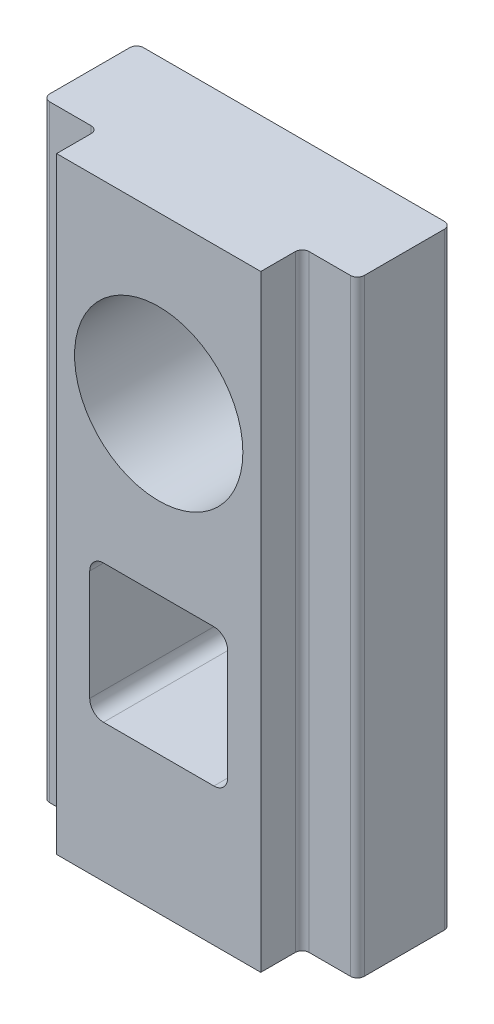
ISO-10303-21;
HEADER;
FILE_DESCRIPTION(('STEP AP214'),'2;1');
FILE_NAME('part.step','',(''),(''),'','','');
FILE_SCHEMA(('AUTOMOTIVE_DESIGN { 1 0 10303 214 1 1 1 1 }'));
ENDSEC;
DATA;
#1=APPLICATION_CONTEXT('core data for automotive mechanical design processes');
#2=APPLICATION_PROTOCOL_DEFINITION('international standard','automotive_design',2000,#1);
#3=PRODUCT_CONTEXT('',#1,'mechanical');
#4=PRODUCT('Part','Part','',(#3));
#5=PRODUCT_RELATED_PRODUCT_CATEGORY('part','',(#4));
#6=PRODUCT_DEFINITION_FORMATION('','',#4);
#7=PRODUCT_DEFINITION_CONTEXT('part definition',#1,'design');
#8=PRODUCT_DEFINITION('design','',#6,#7);
#9=PRODUCT_DEFINITION_SHAPE('','',#8);
#10=(LENGTH_UNIT() NAMED_UNIT(*) SI_UNIT(.MILLI.,.METRE.));
#11=(NAMED_UNIT(*) PLANE_ANGLE_UNIT() SI_UNIT($,.RADIAN.));
#12=(NAMED_UNIT(*) SI_UNIT($,.STERADIAN.) SOLID_ANGLE_UNIT());
#13=UNCERTAINTY_MEASURE_WITH_UNIT(LENGTH_MEASURE(1.E-05),#10,'distance_accuracy_value','');
#14=(GEOMETRIC_REPRESENTATION_CONTEXT(3) GLOBAL_UNCERTAINTY_ASSIGNED_CONTEXT((#13)) GLOBAL_UNIT_ASSIGNED_CONTEXT((#10,
#11,#12)) REPRESENTATION_CONTEXT('',''));
#15=CARTESIAN_POINT('',(0.,0.,0.));
#16=DIRECTION('',(0.,0.,1.));
#17=DIRECTION('',(1.,0.,0.));
#18=AXIS2_PLACEMENT_3D('',#15,#16,#17);
#19=CARTESIAN_POINT('',(5.7,-22.,-0.3));
#20=DIRECTION('',(0.,0.,1.));
#21=DIRECTION('',(1.,0.,0.));
#22=AXIS2_PLACEMENT_3D('',#19,#20,#21);
#23=PLANE('',#22);
#24=DIRECTION('',(1.,0.,0.));
#25=VECTOR('',#24,1.);
#26=CARTESIAN_POINT('',(5.7,-22.,-0.3));
#27=LINE('',#26,#25);
#28=CARTESIAN_POINT('',(3.95,-22.,-0.3));
#29=VERTEX_POINT('',#28);
#30=CARTESIAN_POINT('',(5.45,-22.,-0.3));
#31=VERTEX_POINT('',#30);
#32=EDGE_CURVE('E235',#29,#31,#27,.T.);
#33=ORIENTED_EDGE('',*,*,#32,.T.);
#34=DIRECTION('',(0.,1.,0.));
#35=VECTOR('',#34,1.);
#36=CARTESIAN_POINT('',(5.45,-22.,-0.3));
#37=LINE('',#36,#35);
#38=CARTESIAN_POINT('',(5.45,0.,-0.3));
#39=VERTEX_POINT('',#38);
#40=EDGE_CURVE('E265',#31,#39,#37,.T.);
#41=ORIENTED_EDGE('',*,*,#40,.T.);
#42=DIRECTION('',(1.,0.,0.));
#43=VECTOR('',#42,1.);
#44=CARTESIAN_POINT('',(5.7,0.,-0.3));
#45=LINE('',#44,#43);
#46=CARTESIAN_POINT('',(3.95,0.,-0.3));
#47=VERTEX_POINT('',#46);
#48=EDGE_CURVE('E213',#47,#39,#45,.T.);
#49=ORIENTED_EDGE('',*,*,#48,.F.);
#50=DIRECTION('',(0.,1.,0.));
#51=VECTOR('',#50,1.);
#52=CARTESIAN_POINT('',(3.95,-22.,-0.3));
#53=LINE('',#52,#51);
#54=EDGE_CURVE('E263',#47,#29,#53,.F.);
#55=ORIENTED_EDGE('',*,*,#54,.T.);
#56=EDGE_LOOP('',(#33,#41,#49,#55));
#57=FACE_BOUND('',#56,.T.);
#58=ADVANCED_FACE('F34',(#57),#23,.T.);
#59=CARTESIAN_POINT('',(3.7,-22.,-0.3));
#60=DIRECTION('',(1.,0.,0.));
#61=DIRECTION('',(0.,0.,-1.));
#62=AXIS2_PLACEMENT_3D('',#59,#60,#61);
#63=PLANE('',#62);
#64=DIRECTION('',(0.,0.,-1.));
#65=VECTOR('',#64,1.);
#66=CARTESIAN_POINT('',(3.7,-22.,-0.3));
#67=LINE('',#66,#65);
#68=CARTESIAN_POINT('',(3.7,-22.,1.2));
#69=VERTEX_POINT('',#68);
#70=CARTESIAN_POINT('',(3.7,-22.,-0.0499999999999998));
#71=VERTEX_POINT('',#70);
#72=EDGE_CURVE('E204',#69,#71,#67,.T.);
#73=ORIENTED_EDGE('',*,*,#72,.T.);
#74=DIRECTION('',(0.,1.,0.));
#75=VECTOR('',#74,1.);
#76=CARTESIAN_POINT('',(3.7,0.,-0.0499999999999998));
#77=LINE('',#76,#75);
#78=CARTESIAN_POINT('',(3.7,0.,-0.0499999999999998));
#79=VERTEX_POINT('',#78);
#80=EDGE_CURVE('E268',#71,#79,#77,.T.);
#81=ORIENTED_EDGE('',*,*,#80,.T.);
#82=DIRECTION('',(0.,0.,-1.));
#83=VECTOR('',#82,1.);
#84=CARTESIAN_POINT('',(3.7,0.,-0.3));
#85=LINE('',#84,#83);
#86=CARTESIAN_POINT('',(3.7,0.,1.2));
#87=VERTEX_POINT('',#86);
#88=EDGE_CURVE('E232',#87,#79,#85,.T.);
#89=ORIENTED_EDGE('',*,*,#88,.F.);
#90=DIRECTION('',(0.,1.,0.));
#91=VECTOR('',#90,1.);
#92=CARTESIAN_POINT('',(3.7,-22.,1.2));
#93=LINE('',#92,#91);
#94=EDGE_CURVE('E203',#69,#87,#93,.T.);
#95=ORIENTED_EDGE('',*,*,#94,.F.);
#96=EDGE_LOOP('',(#73,#81,#89,#95));
#97=FACE_BOUND('',#96,.T.);
#98=ADVANCED_FACE('F416',(#97),#63,.T.);
#99=CARTESIAN_POINT('',(-3.7,-22.,1.2));
#100=DIRECTION('',(0.,0.,1.));
#101=DIRECTION('',(1.,0.,0.));
#102=AXIS2_PLACEMENT_3D('',#99,#100,#101);
#103=PLANE('',#102);
#104=CARTESIAN_POINT('',(0.,-6.,1.2));
#105=DIRECTION('',(0.,0.,1.));
#106=DIRECTION('',(1.,0.,0.));
#107=AXIS2_PLACEMENT_3D('',#104,#105,#106);
#108=CIRCLE('',#107,3.05);
#109=CARTESIAN_POINT('',(3.05,-6.,1.2));
#110=VERTEX_POINT('',#109);
#111=EDGE_CURVE('E348',#110,#110,#108,.T.);
#112=ORIENTED_EDGE('',*,*,#111,.F.);
#113=EDGE_LOOP('',(#112));
#114=FACE_BOUND('',#113,.T.);
#115=DIRECTION('',(0.,1.,0.));
#116=VECTOR('',#115,1.);
#117=CARTESIAN_POINT('',(2.5,-12.,1.2));
#118=LINE('',#117,#116);
#119=CARTESIAN_POINT('',(2.5,-16.5,1.2));
#120=VERTEX_POINT('',#119);
#121=CARTESIAN_POINT('',(2.5,-12.5,1.2));
#122=VERTEX_POINT('',#121);
#123=EDGE_CURVE('E324',#120,#122,#118,.T.);
#124=ORIENTED_EDGE('',*,*,#123,.F.);
#125=CARTESIAN_POINT('',(2.,-16.5,1.2));
#126=DIRECTION('',(0.,0.,1.));
#127=DIRECTION('',(1.,0.,0.));
#128=AXIS2_PLACEMENT_3D('',#125,#126,#127);
#129=CIRCLE('',#128,0.5);
#130=CARTESIAN_POINT('',(2.,-17.,1.2));
#131=VERTEX_POINT('',#130);
#132=EDGE_CURVE('E309',#120,#131,#129,.F.);
#133=ORIENTED_EDGE('',*,*,#132,.T.);
#134=DIRECTION('',(1.,0.,0.));
#135=VECTOR('',#134,1.);
#136=CARTESIAN_POINT('',(-2.5,-17.,1.2));
#137=LINE('',#136,#135);
#138=CARTESIAN_POINT('',(-2.,-17.,1.2));
#139=VERTEX_POINT('',#138);
#140=EDGE_CURVE('E343',#139,#131,#137,.T.);
#141=ORIENTED_EDGE('',*,*,#140,.F.);
#142=CARTESIAN_POINT('',(-2.,-16.5,1.2));
#143=DIRECTION('',(0.,0.,1.));
#144=DIRECTION('',(1.,0.,0.));
#145=AXIS2_PLACEMENT_3D('',#142,#143,#144);
#146=CIRCLE('',#145,0.5);
#147=CARTESIAN_POINT('',(-2.5,-16.5,1.2));
#148=VERTEX_POINT('',#147);
#149=EDGE_CURVE('E313',#139,#148,#146,.F.);
#150=ORIENTED_EDGE('',*,*,#149,.T.);
#151=DIRECTION('',(0.,-1.,0.));
#152=VECTOR('',#151,1.);
#153=CARTESIAN_POINT('',(-2.5,-12.,1.2));
#154=LINE('',#153,#152);
#155=CARTESIAN_POINT('',(-2.5,-12.5,1.2));
#156=VERTEX_POINT('',#155);
#157=EDGE_CURVE('E351',#156,#148,#154,.T.);
#158=ORIENTED_EDGE('',*,*,#157,.F.);
#159=CARTESIAN_POINT('',(-2.,-12.5,1.2));
#160=DIRECTION('',(0.,0.,1.));
#161=DIRECTION('',(1.,0.,0.));
#162=AXIS2_PLACEMENT_3D('',#159,#160,#161);
#163=CIRCLE('',#162,0.5);
#164=CARTESIAN_POINT('',(-2.,-12.,1.2));
#165=VERTEX_POINT('',#164);
#166=EDGE_CURVE('E317',#156,#165,#163,.F.);
#167=ORIENTED_EDGE('',*,*,#166,.T.);
#168=DIRECTION('',(-1.,0.,0.));
#169=VECTOR('',#168,1.);
#170=CARTESIAN_POINT('',(-2.5,-12.,1.2));
#171=LINE('',#170,#169);
#172=CARTESIAN_POINT('',(2.,-12.,1.2));
#173=VERTEX_POINT('',#172);
#174=EDGE_CURVE('E325',#173,#165,#171,.T.);
#175=ORIENTED_EDGE('',*,*,#174,.F.);
#176=CARTESIAN_POINT('',(2.,-12.5,1.2));
#177=DIRECTION('',(0.,0.,1.));
#178=DIRECTION('',(1.,0.,0.));
#179=AXIS2_PLACEMENT_3D('',#176,#177,#178);
#180=CIRCLE('',#179,0.5);
#181=EDGE_CURVE('E42',#173,#122,#180,.F.);
#182=ORIENTED_EDGE('',*,*,#181,.T.);
#183=EDGE_LOOP('',(#124,#133,#141,#150,#158,#167,#175,#182));
#184=FACE_BOUND('',#183,.T.);
#185=DIRECTION('',(1.,0.,0.));
#186=VECTOR('',#185,1.);
#187=CARTESIAN_POINT('',(-3.7,0.,1.2));
#188=LINE('',#187,#186);
#189=CARTESIAN_POINT('',(-3.7,0.,1.2));
#190=VERTEX_POINT('',#189);
#191=EDGE_CURVE('E202',#190,#87,#188,.T.);
#192=ORIENTED_EDGE('',*,*,#191,.F.);
#193=DIRECTION('',(0.,1.,0.));
#194=VECTOR('',#193,1.);
#195=CARTESIAN_POINT('',(-3.7,-22.,1.2));
#196=LINE('',#195,#194);
#197=CARTESIAN_POINT('',(-3.7,-22.,1.2));
#198=VERTEX_POINT('',#197);
#199=EDGE_CURVE('E187',#198,#190,#196,.T.);
#200=ORIENTED_EDGE('',*,*,#199,.F.);
#201=DIRECTION('',(1.,0.,0.));
#202=VECTOR('',#201,1.);
#203=CARTESIAN_POINT('',(-3.7,-22.,1.2));
#204=LINE('',#203,#202);
#205=EDGE_CURVE('E194',#198,#69,#204,.T.);
#206=ORIENTED_EDGE('',*,*,#205,.T.);
#207=ORIENTED_EDGE('',*,*,#94,.T.);
#208=EDGE_LOOP('',(#192,#200,#206,#207));
#209=FACE_BOUND('',#208,.T.);
#210=ADVANCED_FACE('F199',(#114,#184,#209),#103,.T.);
#211=CARTESIAN_POINT('',(-3.7,-22.,-0.3));
#212=DIRECTION('',(-1.,0.,0.));
#213=DIRECTION('',(0.,0.,1.));
#214=AXIS2_PLACEMENT_3D('',#211,#212,#213);
#215=PLANE('',#214);
#216=DIRECTION('',(0.,0.,1.));
#217=VECTOR('',#216,1.);
#218=CARTESIAN_POINT('',(-3.7,0.,-0.3));
#219=LINE('',#218,#217);
#220=CARTESIAN_POINT('',(-3.7,0.,-0.05));
#221=VERTEX_POINT('',#220);
#222=EDGE_CURVE('E229',#221,#190,#219,.T.);
#223=ORIENTED_EDGE('',*,*,#222,.F.);
#224=DIRECTION('',(0.,1.,0.));
#225=VECTOR('',#224,1.);
#226=CARTESIAN_POINT('',(-3.7,-22.,-0.05));
#227=LINE('',#226,#225);
#228=CARTESIAN_POINT('',(-3.7,-22.,-0.05));
#229=VERTEX_POINT('',#228);
#230=EDGE_CURVE('E190',#221,#229,#227,.F.);
#231=ORIENTED_EDGE('',*,*,#230,.T.);
#232=DIRECTION('',(0.,0.,1.));
#233=VECTOR('',#232,1.);
#234=CARTESIAN_POINT('',(-3.7,-22.,-0.3));
#235=LINE('',#234,#233);
#236=EDGE_CURVE('E183',#229,#198,#235,.T.);
#237=ORIENTED_EDGE('',*,*,#236,.T.);
#238=ORIENTED_EDGE('',*,*,#199,.T.);
#239=EDGE_LOOP('',(#223,#231,#237,#238));
#240=FACE_BOUND('',#239,.T.);
#241=ADVANCED_FACE('F186',(#240),#215,.T.);
#242=CARTESIAN_POINT('',(-5.7,-22.,-0.3));
#243=DIRECTION('',(0.,0.,1.));
#244=DIRECTION('',(1.,0.,0.));
#245=AXIS2_PLACEMENT_3D('',#242,#243,#244);
#246=PLANE('',#245);
#247=DIRECTION('',(1.,0.,0.));
#248=VECTOR('',#247,1.);
#249=CARTESIAN_POINT('',(-5.7,-22.,-0.3));
#250=LINE('',#249,#248);
#251=CARTESIAN_POINT('',(-5.45,-22.,-0.3));
#252=VERTEX_POINT('',#251);
#253=CARTESIAN_POINT('',(-3.95,-22.,-0.3));
#254=VERTEX_POINT('',#253);
#255=EDGE_CURVE('E195',#252,#254,#250,.T.);
#256=ORIENTED_EDGE('',*,*,#255,.T.);
#257=DIRECTION('',(0.,1.,0.));
#258=VECTOR('',#257,1.);
#259=CARTESIAN_POINT('',(-3.95,0.,-0.3));
#260=LINE('',#259,#258);
#261=CARTESIAN_POINT('',(-3.95,0.,-0.3));
#262=VERTEX_POINT('',#261);
#263=EDGE_CURVE('E273',#254,#262,#260,.T.);
#264=ORIENTED_EDGE('',*,*,#263,.T.);
#265=DIRECTION('',(1.,0.,0.));
#266=VECTOR('',#265,1.);
#267=CARTESIAN_POINT('',(-5.7,0.,-0.3));
#268=LINE('',#267,#266);
#269=CARTESIAN_POINT('',(-5.45,0.,-0.3));
#270=VERTEX_POINT('',#269);
#271=EDGE_CURVE('E226',#270,#262,#268,.T.);
#272=ORIENTED_EDGE('',*,*,#271,.F.);
#273=DIRECTION('',(0.,1.,0.));
#274=VECTOR('',#273,1.);
#275=CARTESIAN_POINT('',(-5.45,-22.,-0.3));
#276=LINE('',#275,#274);
#277=EDGE_CURVE('E271',#270,#252,#276,.F.);
#278=ORIENTED_EDGE('',*,*,#277,.T.);
#279=EDGE_LOOP('',(#256,#264,#272,#278));
#280=FACE_BOUND('',#279,.T.);
#281=ADVANCED_FACE('F370',(#280),#246,.T.);
#282=CARTESIAN_POINT('',(-5.7,-22.,-3.7));
#283=DIRECTION('',(-1.,0.,0.));
#284=DIRECTION('',(0.,0.,1.));
#285=AXIS2_PLACEMENT_3D('',#282,#283,#284);
#286=PLANE('',#285);
#287=DIRECTION('',(0.,0.,1.));
#288=VECTOR('',#287,1.);
#289=CARTESIAN_POINT('',(-5.7,-22.,-3.7));
#290=LINE('',#289,#288);
#291=CARTESIAN_POINT('',(-5.7,-22.,-3.45));
#292=VERTEX_POINT('',#291);
#293=CARTESIAN_POINT('',(-5.7,-22.,-0.55));
#294=VERTEX_POINT('',#293);
#295=EDGE_CURVE('E364',#292,#294,#290,.T.);
#296=ORIENTED_EDGE('',*,*,#295,.T.);
#297=DIRECTION('',(0.,1.,0.));
#298=VECTOR('',#297,1.);
#299=CARTESIAN_POINT('',(-5.7,-22.,-0.55));
#300=LINE('',#299,#298);
#301=CARTESIAN_POINT('',(-5.7,0.,-0.55));
#302=VERTEX_POINT('',#301);
#303=EDGE_CURVE('E279',#294,#302,#300,.T.);
#304=ORIENTED_EDGE('',*,*,#303,.T.);
#305=DIRECTION('',(0.,0.,1.));
#306=VECTOR('',#305,1.);
#307=CARTESIAN_POINT('',(-5.7,0.,-3.7));
#308=LINE('',#307,#306);
#309=CARTESIAN_POINT('',(-5.7,0.,-3.45));
#310=VERTEX_POINT('',#309);
#311=EDGE_CURVE('E223',#310,#302,#308,.T.);
#312=ORIENTED_EDGE('',*,*,#311,.F.);
#313=DIRECTION('',(0.,1.,0.));
#314=VECTOR('',#313,1.);
#315=CARTESIAN_POINT('',(-5.7,-22.,-3.45));
#316=LINE('',#315,#314);
#317=EDGE_CURVE('E277',#310,#292,#316,.F.);
#318=ORIENTED_EDGE('',*,*,#317,.T.);
#319=EDGE_LOOP('',(#296,#304,#312,#318));
#320=FACE_BOUND('',#319,.T.);
#321=ADVANCED_FACE('F384',(#320),#286,.T.);
#322=CARTESIAN_POINT('',(5.7,-22.,-3.7));
#323=DIRECTION('',(0.,0.,-1.));
#324=DIRECTION('',(-1.,0.,0.));
#325=AXIS2_PLACEMENT_3D('',#322,#323,#324);
#326=PLANE('',#325);
#327=CARTESIAN_POINT('',(0.,-6.,-3.7));
#328=DIRECTION('',(0.,0.,1.));
#329=DIRECTION('',(1.,0.,0.));
#330=AXIS2_PLACEMENT_3D('',#327,#328,#329);
#331=CIRCLE('',#330,3.05);
#332=CARTESIAN_POINT('',(3.05,-6.,-3.7));
#333=VERTEX_POINT('',#332);
#334=EDGE_CURVE('E217',#333,#333,#331,.T.);
#335=ORIENTED_EDGE('',*,*,#334,.T.);
#336=EDGE_LOOP('',(#335));
#337=FACE_BOUND('',#336,.T.);
#338=DIRECTION('',(1.,0.,0.));
#339=VECTOR('',#338,1.);
#340=CARTESIAN_POINT('',(-2.5,-17.,-3.7));
#341=LINE('',#340,#339);
#342=CARTESIAN_POINT('',(-2.,-17.,-3.7));
#343=VERTEX_POINT('',#342);
#344=CARTESIAN_POINT('',(2.,-17.,-3.7));
#345=VERTEX_POINT('',#344);
#346=EDGE_CURVE('E341',#343,#345,#341,.T.);
#347=ORIENTED_EDGE('',*,*,#346,.T.);
#348=CARTESIAN_POINT('',(2.,-16.5,-3.7));
#349=DIRECTION('',(0.,0.,-1.));
#350=DIRECTION('',(-1.,0.,0.));
#351=AXIS2_PLACEMENT_3D('',#348,#349,#350);
#352=CIRCLE('',#351,0.5);
#353=CARTESIAN_POINT('',(2.5,-16.5,-3.7));
#354=VERTEX_POINT('',#353);
#355=EDGE_CURVE('E311',#345,#354,#352,.F.);
#356=ORIENTED_EDGE('',*,*,#355,.T.);
#357=DIRECTION('',(0.,1.,0.));
#358=VECTOR('',#357,1.);
#359=CARTESIAN_POINT('',(2.5,-12.,-3.7));
#360=LINE('',#359,#358);
#361=CARTESIAN_POINT('',(2.5,-12.5,-3.7));
#362=VERTEX_POINT('',#361);
#363=EDGE_CURVE('E338',#354,#362,#360,.T.);
#364=ORIENTED_EDGE('',*,*,#363,.T.);
#365=CARTESIAN_POINT('',(2.,-12.5,-3.7));
#366=DIRECTION('',(0.,0.,-1.));
#367=DIRECTION('',(-1.,0.,0.));
#368=AXIS2_PLACEMENT_3D('',#365,#366,#367);
#369=CIRCLE('',#368,0.5);
#370=CARTESIAN_POINT('',(2.,-12.,-3.7));
#371=VERTEX_POINT('',#370);
#372=EDGE_CURVE('E11',#362,#371,#369,.F.);
#373=ORIENTED_EDGE('',*,*,#372,.T.);
#374=DIRECTION('',(-1.,0.,0.));
#375=VECTOR('',#374,1.);
#376=CARTESIAN_POINT('',(-2.5,-12.,-3.7));
#377=LINE('',#376,#375);
#378=CARTESIAN_POINT('',(-2.,-12.,-3.7));
#379=VERTEX_POINT('',#378);
#380=EDGE_CURVE('E335',#371,#379,#377,.T.);
#381=ORIENTED_EDGE('',*,*,#380,.T.);
#382=CARTESIAN_POINT('',(-2.,-12.5,-3.7));
#383=DIRECTION('',(0.,0.,-1.));
#384=DIRECTION('',(-1.,0.,0.));
#385=AXIS2_PLACEMENT_3D('',#382,#383,#384);
#386=CIRCLE('',#385,0.5);
#387=CARTESIAN_POINT('',(-2.5,-12.5,-3.7));
#388=VERTEX_POINT('',#387);
#389=EDGE_CURVE('E319',#379,#388,#386,.F.);
#390=ORIENTED_EDGE('',*,*,#389,.T.);
#391=DIRECTION('',(0.,-1.,0.));
#392=VECTOR('',#391,1.);
#393=CARTESIAN_POINT('',(-2.5,-12.,-3.7));
#394=LINE('',#393,#392);
#395=CARTESIAN_POINT('',(-2.5,-16.5,-3.7));
#396=VERTEX_POINT('',#395);
#397=EDGE_CURVE('E337',#388,#396,#394,.T.);
#398=ORIENTED_EDGE('',*,*,#397,.T.);
#399=CARTESIAN_POINT('',(-2.,-16.5,-3.7));
#400=DIRECTION('',(0.,0.,-1.));
#401=DIRECTION('',(-1.,0.,0.));
#402=AXIS2_PLACEMENT_3D('',#399,#400,#401);
#403=CIRCLE('',#402,0.5);
#404=EDGE_CURVE('E315',#396,#343,#403,.F.);
#405=ORIENTED_EDGE('',*,*,#404,.T.);
#406=EDGE_LOOP('',(#347,#356,#364,#373,#381,#390,#398,#405));
#407=FACE_BOUND('',#406,.T.);
#408=DIRECTION('',(-1.,0.,0.));
#409=VECTOR('',#408,1.);
#410=CARTESIAN_POINT('',(5.7,0.,-3.7));
#411=LINE('',#410,#409);
#412=CARTESIAN_POINT('',(5.45,0.,-3.7));
#413=VERTEX_POINT('',#412);
#414=CARTESIAN_POINT('',(-5.45,0.,-3.7));
#415=VERTEX_POINT('',#414);
#416=EDGE_CURVE('E220',#413,#415,#411,.T.);
#417=ORIENTED_EDGE('',*,*,#416,.F.);
#418=DIRECTION('',(0.,1.,0.));
#419=VECTOR('',#418,1.);
#420=CARTESIAN_POINT('',(5.45,-22.,-3.7));
#421=LINE('',#420,#419);
#422=CARTESIAN_POINT('',(5.45,-22.,-3.7));
#423=VERTEX_POINT('',#422);
#424=EDGE_CURVE('E253',#413,#423,#421,.F.);
#425=ORIENTED_EDGE('',*,*,#424,.T.);
#426=DIRECTION('',(-1.,0.,0.));
#427=VECTOR('',#426,1.);
#428=CARTESIAN_POINT('',(5.7,-22.,-3.7));
#429=LINE('',#428,#427);
#430=CARTESIAN_POINT('',(-5.45,-22.,-3.7));
#431=VERTEX_POINT('',#430);
#432=EDGE_CURVE('E361',#423,#431,#429,.T.);
#433=ORIENTED_EDGE('',*,*,#432,.T.);
#434=DIRECTION('',(0.,1.,0.));
#435=VECTOR('',#434,1.);
#436=CARTESIAN_POINT('',(-5.45,-22.,-3.7));
#437=LINE('',#436,#435);
#438=EDGE_CURVE('E250',#431,#415,#437,.T.);
#439=ORIENTED_EDGE('',*,*,#438,.T.);
#440=EDGE_LOOP('',(#417,#425,#433,#439));
#441=FACE_BOUND('',#440,.T.);
#442=ADVANCED_FACE('F393',(#337,#407,#441),#326,.T.);
#443=CARTESIAN_POINT('',(5.7,-22.,-3.7));
#444=DIRECTION('',(1.,0.,0.));
#445=DIRECTION('',(0.,0.,-1.));
#446=AXIS2_PLACEMENT_3D('',#443,#444,#445);
#447=PLANE('',#446);
#448=DIRECTION('',(0.,0.,-1.));
#449=VECTOR('',#448,1.);
#450=CARTESIAN_POINT('',(5.7,-22.,-3.7));
#451=LINE('',#450,#449);
#452=CARTESIAN_POINT('',(5.7,-22.,-0.55));
#453=VERTEX_POINT('',#452);
#454=CARTESIAN_POINT('',(5.7,-22.,-3.45));
#455=VERTEX_POINT('',#454);
#456=EDGE_CURVE('E358',#453,#455,#451,.T.);
#457=ORIENTED_EDGE('',*,*,#456,.T.);
#458=DIRECTION('',(0.,1.,0.));
#459=VECTOR('',#458,1.);
#460=CARTESIAN_POINT('',(5.7,-22.,-3.45));
#461=LINE('',#460,#459);
#462=CARTESIAN_POINT('',(5.7,0.,-3.45));
#463=VERTEX_POINT('',#462);
#464=EDGE_CURVE('E239',#455,#463,#461,.T.);
#465=ORIENTED_EDGE('',*,*,#464,.T.);
#466=DIRECTION('',(0.,0.,-1.));
#467=VECTOR('',#466,1.);
#468=CARTESIAN_POINT('',(5.7,0.,-3.7));
#469=LINE('',#468,#467);
#470=CARTESIAN_POINT('',(5.7,0.,-0.55));
#471=VERTEX_POINT('',#470);
#472=EDGE_CURVE('E216',#471,#463,#469,.T.);
#473=ORIENTED_EDGE('',*,*,#472,.F.);
#474=DIRECTION('',(0.,1.,0.));
#475=VECTOR('',#474,1.);
#476=CARTESIAN_POINT('',(5.7,-22.,-0.55));
#477=LINE('',#476,#475);
#478=EDGE_CURVE('E236',#471,#453,#477,.F.);
#479=ORIENTED_EDGE('',*,*,#478,.T.);
#480=EDGE_LOOP('',(#457,#465,#473,#479));
#481=FACE_BOUND('',#480,.T.);
#482=ADVANCED_FACE('F401',(#481),#447,.T.);
#483=CARTESIAN_POINT('',(0.,-22.,0.));
#484=DIRECTION('',(0.,1.,0.));
#485=DIRECTION('',(0.,0.,1.));
#486=AXIS2_PLACEMENT_3D('',#483,#484,#485);
#487=PLANE('',#486);
#488=ORIENTED_EDGE('',*,*,#432,.F.);
#489=CARTESIAN_POINT('',(5.45,-22.,-3.45));
#490=DIRECTION('',(0.,1.,0.));
#491=DIRECTION('',(0.,0.,1.));
#492=AXIS2_PLACEMENT_3D('',#489,#490,#491);
#493=CIRCLE('',#492,0.25);
#494=EDGE_CURVE('E261',#423,#455,#493,.F.);
#495=ORIENTED_EDGE('',*,*,#494,.T.);
#496=ORIENTED_EDGE('',*,*,#456,.F.);
#497=CARTESIAN_POINT('',(5.45,-22.,-0.55));
#498=DIRECTION('',(0.,1.,0.));
#499=DIRECTION('',(0.,0.,1.));
#500=AXIS2_PLACEMENT_3D('',#497,#498,#499);
#501=CIRCLE('',#500,0.25);
#502=EDGE_CURVE('E259',#453,#31,#501,.F.);
#503=ORIENTED_EDGE('',*,*,#502,.T.);
#504=ORIENTED_EDGE('',*,*,#32,.F.);
#505=CARTESIAN_POINT('',(3.95,-22.,-0.0499999999999998));
#506=DIRECTION('',(0.,1.,0.));
#507=DIRECTION('',(0.,0.,1.));
#508=AXIS2_PLACEMENT_3D('',#505,#506,#507);
#509=CIRCLE('',#508,0.25);
#510=EDGE_CURVE('E284',#29,#71,#509,.T.);
#511=ORIENTED_EDGE('',*,*,#510,.T.);
#512=ORIENTED_EDGE('',*,*,#72,.F.);
#513=ORIENTED_EDGE('',*,*,#205,.F.);
#514=ORIENTED_EDGE('',*,*,#236,.F.);
#515=CARTESIAN_POINT('',(-3.95,-22.,-0.05));
#516=DIRECTION('',(0.,1.,0.));
#517=DIRECTION('',(0.,0.,1.));
#518=AXIS2_PLACEMENT_3D('',#515,#516,#517);
#519=CIRCLE('',#518,0.25);
#520=EDGE_CURVE('E288',#229,#254,#519,.T.);
#521=ORIENTED_EDGE('',*,*,#520,.T.);
#522=ORIENTED_EDGE('',*,*,#255,.F.);
#523=CARTESIAN_POINT('',(-5.45,-22.,-0.55));
#524=DIRECTION('',(0.,1.,0.));
#525=DIRECTION('',(0.,0.,1.));
#526=AXIS2_PLACEMENT_3D('',#523,#524,#525);
#527=CIRCLE('',#526,0.25);
#528=EDGE_CURVE('E257',#252,#294,#527,.F.);
#529=ORIENTED_EDGE('',*,*,#528,.T.);
#530=ORIENTED_EDGE('',*,*,#295,.F.);
#531=CARTESIAN_POINT('',(-5.45,-22.,-3.45));
#532=DIRECTION('',(0.,1.,0.));
#533=DIRECTION('',(0.,0.,1.));
#534=AXIS2_PLACEMENT_3D('',#531,#532,#533);
#535=CIRCLE('',#534,0.25);
#536=EDGE_CURVE('E255',#292,#431,#535,.F.);
#537=ORIENTED_EDGE('',*,*,#536,.T.);
#538=EDGE_LOOP('',(#488,#495,#496,#503,#504,#511,#512,#513,#514,#521,#522,#529,#530,#537));
#539=FACE_BOUND('',#538,.T.);
#540=ADVANCED_FACE('F207',(#539),#487,.F.);
#541=CARTESIAN_POINT('',(0.,0.,0.));
#542=DIRECTION('',(0.,1.,0.));
#543=DIRECTION('',(0.,0.,1.));
#544=AXIS2_PLACEMENT_3D('',#541,#542,#543);
#545=PLANE('',#544);
#546=ORIENTED_EDGE('',*,*,#472,.T.);
#547=CARTESIAN_POINT('',(5.45,0.,-3.45));
#548=DIRECTION('',(0.,1.,0.));
#549=DIRECTION('',(0.,0.,1.));
#550=AXIS2_PLACEMENT_3D('',#547,#548,#549);
#551=CIRCLE('',#550,0.25);
#552=EDGE_CURVE('E248',#463,#413,#551,.T.);
#553=ORIENTED_EDGE('',*,*,#552,.T.);
#554=ORIENTED_EDGE('',*,*,#416,.T.);
#555=CARTESIAN_POINT('',(-5.45,0.,-3.45));
#556=DIRECTION('',(0.,1.,0.));
#557=DIRECTION('',(0.,0.,1.));
#558=AXIS2_PLACEMENT_3D('',#555,#556,#557);
#559=CIRCLE('',#558,0.25);
#560=EDGE_CURVE('E242',#415,#310,#559,.T.);
#561=ORIENTED_EDGE('',*,*,#560,.T.);
#562=ORIENTED_EDGE('',*,*,#311,.T.);
#563=CARTESIAN_POINT('',(-5.45,0.,-0.55));
#564=DIRECTION('',(0.,1.,0.));
#565=DIRECTION('',(0.,0.,1.));
#566=AXIS2_PLACEMENT_3D('',#563,#564,#565);
#567=CIRCLE('',#566,0.25);
#568=EDGE_CURVE('E244',#302,#270,#567,.T.);
#569=ORIENTED_EDGE('',*,*,#568,.T.);
#570=ORIENTED_EDGE('',*,*,#271,.T.);
#571=CARTESIAN_POINT('',(-3.95,0.,-0.05));
#572=DIRECTION('',(0.,1.,0.));
#573=DIRECTION('',(0.,0.,1.));
#574=AXIS2_PLACEMENT_3D('',#571,#572,#573);
#575=CIRCLE('',#574,0.25);
#576=EDGE_CURVE('E286',#262,#221,#575,.F.);
#577=ORIENTED_EDGE('',*,*,#576,.T.);
#578=ORIENTED_EDGE('',*,*,#222,.T.);
#579=ORIENTED_EDGE('',*,*,#191,.T.);
#580=ORIENTED_EDGE('',*,*,#88,.T.);
#581=CARTESIAN_POINT('',(3.95,0.,-0.0499999999999998));
#582=DIRECTION('',(0.,1.,0.));
#583=DIRECTION('',(0.,0.,1.));
#584=AXIS2_PLACEMENT_3D('',#581,#582,#583);
#585=CIRCLE('',#584,0.25);
#586=EDGE_CURVE('E282',#79,#47,#585,.F.);
#587=ORIENTED_EDGE('',*,*,#586,.T.);
#588=ORIENTED_EDGE('',*,*,#48,.T.);
#589=CARTESIAN_POINT('',(5.45,0.,-0.55));
#590=DIRECTION('',(0.,1.,0.));
#591=DIRECTION('',(0.,0.,1.));
#592=AXIS2_PLACEMENT_3D('',#589,#590,#591);
#593=CIRCLE('',#592,0.25);
#594=EDGE_CURVE('E246',#39,#471,#593,.T.);
#595=ORIENTED_EDGE('',*,*,#594,.T.);
#596=EDGE_LOOP('',(#546,#553,#554,#561,#562,#569,#570,#577,#578,#579,#580,#587,#588,#595));
#597=FACE_BOUND('',#596,.T.);
#598=ADVANCED_FACE('F377',(#597),#545,.T.);
#599=CARTESIAN_POINT('',(2.5,-12.,-3.7));
#600=DIRECTION('',(1.,0.,0.));
#601=DIRECTION('',(0.,1.,0.));
#602=AXIS2_PLACEMENT_3D('',#599,#600,#601);
#603=PLANE('',#602);
#604=ORIENTED_EDGE('',*,*,#363,.F.);
#605=DIRECTION('',(0.,0.,1.));
#606=VECTOR('',#605,1.);
#607=CARTESIAN_POINT('',(2.5,-16.5,1.2));
#608=LINE('',#607,#606);
#609=EDGE_CURVE('E292',#354,#120,#608,.T.);
#610=ORIENTED_EDGE('',*,*,#609,.T.);
#611=ORIENTED_EDGE('',*,*,#123,.T.);
#612=DIRECTION('',(0.,0.,1.));
#613=VECTOR('',#612,1.);
#614=CARTESIAN_POINT('',(2.5,-12.5,-3.7));
#615=LINE('',#614,#613);
#616=EDGE_CURVE('E290',#122,#362,#615,.F.);
#617=ORIENTED_EDGE('',*,*,#616,.T.);
#618=EDGE_LOOP('',(#604,#610,#611,#617));
#619=FACE_BOUND('',#618,.T.);
#620=ADVANCED_FACE('F331',(#619),#603,.F.);
#621=CARTESIAN_POINT('',(-2.5,-17.,-3.7));
#622=DIRECTION('',(0.,-1.,0.));
#623=DIRECTION('',(0.,0.,-1.));
#624=AXIS2_PLACEMENT_3D('',#621,#622,#623);
#625=PLANE('',#624);
#626=ORIENTED_EDGE('',*,*,#140,.T.);
#627=DIRECTION('',(0.,0.,1.));
#628=VECTOR('',#627,1.);
#629=CARTESIAN_POINT('',(2.,-17.,-3.7));
#630=LINE('',#629,#628);
#631=EDGE_CURVE('E298',#131,#345,#630,.F.);
#632=ORIENTED_EDGE('',*,*,#631,.T.);
#633=ORIENTED_EDGE('',*,*,#346,.F.);
#634=DIRECTION('',(0.,0.,1.));
#635=VECTOR('',#634,1.);
#636=CARTESIAN_POINT('',(-2.,-17.,1.2));
#637=LINE('',#636,#635);
#638=EDGE_CURVE('E295',#343,#139,#637,.T.);
#639=ORIENTED_EDGE('',*,*,#638,.T.);
#640=EDGE_LOOP('',(#626,#632,#633,#639));
#641=FACE_BOUND('',#640,.T.);
#642=ADVANCED_FACE('F478',(#641),#625,.F.);
#643=CARTESIAN_POINT('',(-2.5,-12.,-3.7));
#644=DIRECTION('',(-1.,0.,0.));
#645=DIRECTION('',(0.,-1.,0.));
#646=AXIS2_PLACEMENT_3D('',#643,#644,#645);
#647=PLANE('',#646);
#648=ORIENTED_EDGE('',*,*,#157,.T.);
#649=DIRECTION('',(0.,0.,1.));
#650=VECTOR('',#649,1.);
#651=CARTESIAN_POINT('',(-2.5,-16.5,-3.7));
#652=LINE('',#651,#650);
#653=EDGE_CURVE('E303',#148,#396,#652,.F.);
#654=ORIENTED_EDGE('',*,*,#653,.T.);
#655=ORIENTED_EDGE('',*,*,#397,.F.);
#656=DIRECTION('',(0.,0.,1.));
#657=VECTOR('',#656,1.);
#658=CARTESIAN_POINT('',(-2.5,-12.5,1.2));
#659=LINE('',#658,#657);
#660=EDGE_CURVE('E300',#388,#156,#659,.T.);
#661=ORIENTED_EDGE('',*,*,#660,.T.);
#662=EDGE_LOOP('',(#648,#654,#655,#661));
#663=FACE_BOUND('',#662,.T.);
#664=ADVANCED_FACE('F471',(#663),#647,.F.);
#665=CARTESIAN_POINT('',(-2.5,-12.,-3.7));
#666=DIRECTION('',(0.,1.,0.));
#667=DIRECTION('',(0.,0.,1.));
#668=AXIS2_PLACEMENT_3D('',#665,#666,#667);
#669=PLANE('',#668);
#670=ORIENTED_EDGE('',*,*,#174,.T.);
#671=DIRECTION('',(0.,0.,1.));
#672=VECTOR('',#671,1.);
#673=CARTESIAN_POINT('',(-2.,-12.,-3.7));
#674=LINE('',#673,#672);
#675=EDGE_CURVE('E49',#165,#379,#674,.F.);
#676=ORIENTED_EDGE('',*,*,#675,.T.);
#677=ORIENTED_EDGE('',*,*,#380,.F.);
#678=DIRECTION('',(0.,0.,1.));
#679=VECTOR('',#678,1.);
#680=CARTESIAN_POINT('',(2.,-12.,1.2));
#681=LINE('',#680,#679);
#682=EDGE_CURVE('E305',#371,#173,#681,.T.);
#683=ORIENTED_EDGE('',*,*,#682,.T.);
#684=EDGE_LOOP('',(#670,#676,#677,#683));
#685=FACE_BOUND('',#684,.T.);
#686=ADVANCED_FACE('F334',(#685),#669,.F.);
#687=CARTESIAN_POINT('',(0.,-6.,-3.7));
#688=DIRECTION('',(0.,0.,1.));
#689=DIRECTION('',(1.,0.,0.));
#690=AXIS2_PLACEMENT_3D('',#687,#688,#689);
#691=CYLINDRICAL_SURFACE('',#690,3.05);
#692=ORIENTED_EDGE('',*,*,#334,.F.);
#693=EDGE_LOOP('',(#692));
#694=FACE_BOUND('',#693,.T.);
#695=ORIENTED_EDGE('',*,*,#111,.T.);
#696=EDGE_LOOP('',(#695));
#697=FACE_BOUND('',#696,.T.);
#698=ADVANCED_FACE('F443',(#694,#697),#691,.F.);
#699=CARTESIAN_POINT('',(5.45,-22.,-3.45));
#700=DIRECTION('',(0.,1.,0.));
#701=DIRECTION('',(0.,0.,1.));
#702=AXIS2_PLACEMENT_3D('',#699,#700,#701);
#703=CYLINDRICAL_SURFACE('',#702,0.25);
#704=ORIENTED_EDGE('',*,*,#494,.F.);
#705=ORIENTED_EDGE('',*,*,#424,.F.);
#706=ORIENTED_EDGE('',*,*,#552,.F.);
#707=ORIENTED_EDGE('',*,*,#464,.F.);
#708=EDGE_LOOP('',(#704,#705,#706,#707));
#709=FACE_BOUND('',#708,.T.);
#710=ADVANCED_FACE('F396',(#709),#703,.T.);
#711=CARTESIAN_POINT('',(5.45,-22.,-0.55));
#712=DIRECTION('',(0.,1.,0.));
#713=DIRECTION('',(0.,0.,1.));
#714=AXIS2_PLACEMENT_3D('',#711,#712,#713);
#715=CYLINDRICAL_SURFACE('',#714,0.25);
#716=ORIENTED_EDGE('',*,*,#502,.F.);
#717=ORIENTED_EDGE('',*,*,#478,.F.);
#718=ORIENTED_EDGE('',*,*,#594,.F.);
#719=ORIENTED_EDGE('',*,*,#40,.F.);
#720=EDGE_LOOP('',(#716,#717,#718,#719));
#721=FACE_BOUND('',#720,.T.);
#722=ADVANCED_FACE('F405',(#721),#715,.T.);
#723=CARTESIAN_POINT('',(3.95,-22.,-0.0499999999999998));
#724=DIRECTION('',(0.,-1.,0.));
#725=DIRECTION('',(0.,0.,-1.));
#726=AXIS2_PLACEMENT_3D('',#723,#724,#725);
#727=CYLINDRICAL_SURFACE('',#726,0.25);
#728=ORIENTED_EDGE('',*,*,#510,.F.);
#729=ORIENTED_EDGE('',*,*,#54,.F.);
#730=ORIENTED_EDGE('',*,*,#586,.F.);
#731=ORIENTED_EDGE('',*,*,#80,.F.);
#732=EDGE_LOOP('',(#728,#729,#730,#731));
#733=FACE_BOUND('',#732,.T.);
#734=ADVANCED_FACE('F413',(#733),#727,.F.);
#735=CARTESIAN_POINT('',(-3.95,-22.,-0.05));
#736=DIRECTION('',(0.,-1.,0.));
#737=DIRECTION('',(0.,0.,-1.));
#738=AXIS2_PLACEMENT_3D('',#735,#736,#737);
#739=CYLINDRICAL_SURFACE('',#738,0.25);
#740=ORIENTED_EDGE('',*,*,#520,.F.);
#741=ORIENTED_EDGE('',*,*,#230,.F.);
#742=ORIENTED_EDGE('',*,*,#576,.F.);
#743=ORIENTED_EDGE('',*,*,#263,.F.);
#744=EDGE_LOOP('',(#740,#741,#742,#743));
#745=FACE_BOUND('',#744,.T.);
#746=ADVANCED_FACE('F375',(#745),#739,.F.);
#747=CARTESIAN_POINT('',(-5.45,-22.,-0.55));
#748=DIRECTION('',(0.,1.,0.));
#749=DIRECTION('',(0.,0.,1.));
#750=AXIS2_PLACEMENT_3D('',#747,#748,#749);
#751=CYLINDRICAL_SURFACE('',#750,0.25);
#752=ORIENTED_EDGE('',*,*,#528,.F.);
#753=ORIENTED_EDGE('',*,*,#277,.F.);
#754=ORIENTED_EDGE('',*,*,#568,.F.);
#755=ORIENTED_EDGE('',*,*,#303,.F.);
#756=EDGE_LOOP('',(#752,#753,#754,#755));
#757=FACE_BOUND('',#756,.T.);
#758=ADVANCED_FACE('F379',(#757),#751,.T.);
#759=CARTESIAN_POINT('',(-5.45,-22.,-3.45));
#760=DIRECTION('',(0.,1.,0.));
#761=DIRECTION('',(0.,0.,1.));
#762=AXIS2_PLACEMENT_3D('',#759,#760,#761);
#763=CYLINDRICAL_SURFACE('',#762,0.25);
#764=ORIENTED_EDGE('',*,*,#536,.F.);
#765=ORIENTED_EDGE('',*,*,#317,.F.);
#766=ORIENTED_EDGE('',*,*,#560,.F.);
#767=ORIENTED_EDGE('',*,*,#438,.F.);
#768=EDGE_LOOP('',(#764,#765,#766,#767));
#769=FACE_BOUND('',#768,.T.);
#770=ADVANCED_FACE('F388',(#769),#763,.T.);
#771=CARTESIAN_POINT('',(2.,-16.5,-3.7));
#772=DIRECTION('',(0.,0.,-1.));
#773=DIRECTION('',(-1.,0.,0.));
#774=AXIS2_PLACEMENT_3D('',#771,#772,#773);
#775=CYLINDRICAL_SURFACE('',#774,0.5);
#776=ORIENTED_EDGE('',*,*,#355,.F.);
#777=ORIENTED_EDGE('',*,*,#631,.F.);
#778=ORIENTED_EDGE('',*,*,#132,.F.);
#779=ORIENTED_EDGE('',*,*,#609,.F.);
#780=EDGE_LOOP('',(#776,#777,#778,#779));
#781=FACE_BOUND('',#780,.T.);
#782=ADVANCED_FACE('F454',(#781),#775,.F.);
#783=CARTESIAN_POINT('',(-2.,-16.5,-3.7));
#784=DIRECTION('',(0.,0.,-1.));
#785=DIRECTION('',(-1.,0.,0.));
#786=AXIS2_PLACEMENT_3D('',#783,#784,#785);
#787=CYLINDRICAL_SURFACE('',#786,0.5);
#788=ORIENTED_EDGE('',*,*,#404,.F.);
#789=ORIENTED_EDGE('',*,*,#653,.F.);
#790=ORIENTED_EDGE('',*,*,#149,.F.);
#791=ORIENTED_EDGE('',*,*,#638,.F.);
#792=EDGE_LOOP('',(#788,#789,#790,#791));
#793=FACE_BOUND('',#792,.T.);
#794=ADVANCED_FACE('F457',(#793),#787,.F.);
#795=CARTESIAN_POINT('',(-2.,-12.5,-3.7));
#796=DIRECTION('',(0.,0.,-1.));
#797=DIRECTION('',(-1.,0.,0.));
#798=AXIS2_PLACEMENT_3D('',#795,#796,#797);
#799=CYLINDRICAL_SURFACE('',#798,0.5);
#800=ORIENTED_EDGE('',*,*,#389,.F.);
#801=ORIENTED_EDGE('',*,*,#675,.F.);
#802=ORIENTED_EDGE('',*,*,#166,.F.);
#803=ORIENTED_EDGE('',*,*,#660,.F.);
#804=EDGE_LOOP('',(#800,#801,#802,#803));
#805=FACE_BOUND('',#804,.T.);
#806=ADVANCED_FACE('F460',(#805),#799,.F.);
#807=CARTESIAN_POINT('',(2.,-12.5,-3.7));
#808=DIRECTION('',(0.,0.,-1.));
#809=DIRECTION('',(-1.,0.,0.));
#810=AXIS2_PLACEMENT_3D('',#807,#808,#809);
#811=CYLINDRICAL_SURFACE('',#810,0.5);
#812=ORIENTED_EDGE('',*,*,#372,.F.);
#813=ORIENTED_EDGE('',*,*,#616,.F.);
#814=ORIENTED_EDGE('',*,*,#181,.F.);
#815=ORIENTED_EDGE('',*,*,#682,.F.);
#816=EDGE_LOOP('',(#812,#813,#814,#815));
#817=FACE_BOUND('',#816,.T.);
#818=ADVANCED_FACE('F36',(#817),#811,.F.);
#819=CLOSED_SHELL('',(#58,#98,#210,#241,#281,#321,#442,#482,#540,#598,#620,#642,#664,#686,#698,
#710,#722,#734,#746,#758,#770,#782,#794,#806,#818));
#820=MANIFOLD_SOLID_BREP('B2',#819);
#821=ADVANCED_BREP_SHAPE_REPRESENTATION('',(#18,#820),#14);
#822=SHAPE_DEFINITION_REPRESENTATION(#9,#821);
ENDSEC;
END-ISO-10303-21;
